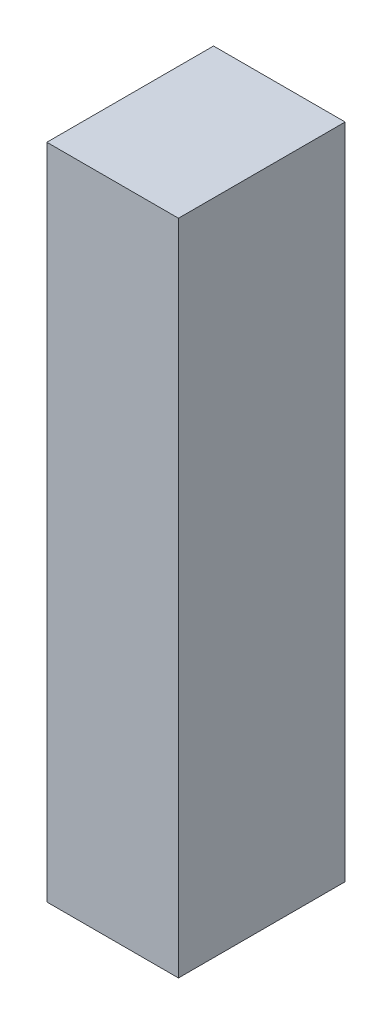
ISO-10303-21;
HEADER;
FILE_DESCRIPTION(('STEP AP214'),'2;1');
FILE_NAME('part.step','',(''),(''),'','','');
FILE_SCHEMA(('AUTOMOTIVE_DESIGN { 1 0 10303 214 1 1 1 1 }'));
ENDSEC;
DATA;
#1=APPLICATION_CONTEXT('core data for automotive mechanical design processes');
#2=APPLICATION_PROTOCOL_DEFINITION('international standard','automotive_design',2000,#1);
#3=PRODUCT_CONTEXT('',#1,'mechanical');
#4=PRODUCT('Part','Part','',(#3));
#5=PRODUCT_RELATED_PRODUCT_CATEGORY('part','',(#4));
#6=PRODUCT_DEFINITION_FORMATION('','',#4);
#7=PRODUCT_DEFINITION_CONTEXT('part definition',#1,'design');
#8=PRODUCT_DEFINITION('design','',#6,#7);
#9=PRODUCT_DEFINITION_SHAPE('','',#8);
#10=(LENGTH_UNIT() NAMED_UNIT(*) SI_UNIT(.MILLI.,.METRE.));
#11=(NAMED_UNIT(*) PLANE_ANGLE_UNIT() SI_UNIT($,.RADIAN.));
#12=(NAMED_UNIT(*) SI_UNIT($,.STERADIAN.) SOLID_ANGLE_UNIT());
#13=UNCERTAINTY_MEASURE_WITH_UNIT(LENGTH_MEASURE(1.E-05),#10,'distance_accuracy_value','');
#14=(GEOMETRIC_REPRESENTATION_CONTEXT(3) GLOBAL_UNCERTAINTY_ASSIGNED_CONTEXT((#13)) GLOBAL_UNIT_ASSIGNED_CONTEXT((#10,
#11,#12)) REPRESENTATION_CONTEXT('',''));
#15=CARTESIAN_POINT('',(0.,0.,0.));
#16=DIRECTION('',(0.,0.,1.));
#17=DIRECTION('',(1.,0.,0.));
#18=AXIS2_PLACEMENT_3D('',#15,#16,#17);
#19=CARTESIAN_POINT('',(7.5,75.,9.50000000000001));
#20=DIRECTION('',(-1.,0.,0.));
#21=DIRECTION('',(0.,0.,1.));
#22=AXIS2_PLACEMENT_3D('',#19,#20,#21);
#23=PLANE('',#22);
#24=DIRECTION('',(0.,0.,-1.));
#25=VECTOR('',#24,1.);
#26=CARTESIAN_POINT('',(7.5,0.,9.50000000000001));
#27=LINE('',#26,#25);
#28=CARTESIAN_POINT('',(7.5,0.,9.50000000000001));
#29=VERTEX_POINT('',#28);
#30=CARTESIAN_POINT('',(7.5,0.,-9.49999999999999));
#31=VERTEX_POINT('',#30);
#32=EDGE_CURVE('E97',#29,#31,#27,.T.);
#33=ORIENTED_EDGE('',*,*,#32,.T.);
#34=DIRECTION('',(0.,-1.,0.));
#35=VECTOR('',#34,1.);
#36=CARTESIAN_POINT('',(7.5,75.,-9.49999999999999));
#37=LINE('',#36,#35);
#38=CARTESIAN_POINT('',(7.5,75.,-9.49999999999999));
#39=VERTEX_POINT('',#38);
#40=EDGE_CURVE('E11',#39,#31,#37,.T.);
#41=ORIENTED_EDGE('',*,*,#40,.F.);
#42=DIRECTION('',(0.,0.,-1.));
#43=VECTOR('',#42,1.);
#44=CARTESIAN_POINT('',(7.5,75.,9.50000000000001));
#45=LINE('',#44,#43);
#46=CARTESIAN_POINT('',(7.5,75.,9.50000000000001));
#47=VERTEX_POINT('',#46);
#48=EDGE_CURVE('E85',#47,#39,#45,.T.);
#49=ORIENTED_EDGE('',*,*,#48,.F.);
#50=DIRECTION('',(0.,-1.,0.));
#51=VECTOR('',#50,1.);
#52=CARTESIAN_POINT('',(7.5,75.,9.50000000000001));
#53=LINE('',#52,#51);
#54=EDGE_CURVE('E93',#47,#29,#53,.T.);
#55=ORIENTED_EDGE('',*,*,#54,.T.);
#56=EDGE_LOOP('',(#33,#41,#49,#55));
#57=FACE_BOUND('',#56,.T.);
#58=ADVANCED_FACE('F34',(#57),#23,.F.);
#59=CARTESIAN_POINT('',(-7.5,75.,-9.49999999999999));
#60=DIRECTION('',(0.,0.,1.));
#61=DIRECTION('',(1.,0.,0.));
#62=AXIS2_PLACEMENT_3D('',#59,#60,#61);
#63=PLANE('',#62);
#64=DIRECTION('',(-1.,0.,0.));
#65=VECTOR('',#64,1.);
#66=CARTESIAN_POINT('',(-7.5,0.,-9.49999999999999));
#67=LINE('',#66,#65);
#68=CARTESIAN_POINT('',(-7.5,0.,-9.49999999999999));
#69=VERTEX_POINT('',#68);
#70=EDGE_CURVE('E89',#31,#69,#67,.T.);
#71=ORIENTED_EDGE('',*,*,#70,.T.);
#72=DIRECTION('',(0.,-1.,0.));
#73=VECTOR('',#72,1.);
#74=CARTESIAN_POINT('',(-7.5,75.,-9.49999999999999));
#75=LINE('',#74,#73);
#76=CARTESIAN_POINT('',(-7.5,75.,-9.49999999999999));
#77=VERTEX_POINT('',#76);
#78=EDGE_CURVE('E42',#77,#69,#75,.T.);
#79=ORIENTED_EDGE('',*,*,#78,.F.);
#80=DIRECTION('',(-1.,0.,0.));
#81=VECTOR('',#80,1.);
#82=CARTESIAN_POINT('',(-7.5,75.,-9.49999999999999));
#83=LINE('',#82,#81);
#84=EDGE_CURVE('E80',#39,#77,#83,.T.);
#85=ORIENTED_EDGE('',*,*,#84,.F.);
#86=ORIENTED_EDGE('',*,*,#40,.T.);
#87=EDGE_LOOP('',(#71,#79,#85,#86));
#88=FACE_BOUND('',#87,.T.);
#89=ADVANCED_FACE('F88',(#88),#63,.F.);
#90=CARTESIAN_POINT('',(-7.5,75.,9.50000000000001));
#91=DIRECTION('',(1.,0.,0.));
#92=DIRECTION('',(0.,0.,-1.));
#93=AXIS2_PLACEMENT_3D('',#90,#91,#92);
#94=PLANE('',#93);
#95=DIRECTION('',(0.,0.,1.));
#96=VECTOR('',#95,1.);
#97=CARTESIAN_POINT('',(-7.5,0.,9.50000000000001));
#98=LINE('',#97,#96);
#99=CARTESIAN_POINT('',(-7.5,0.,9.50000000000001));
#100=VERTEX_POINT('',#99);
#101=EDGE_CURVE('E67',#69,#100,#98,.T.);
#102=ORIENTED_EDGE('',*,*,#101,.T.);
#103=DIRECTION('',(0.,-1.,0.));
#104=VECTOR('',#103,1.);
#105=CARTESIAN_POINT('',(-7.5,75.,9.50000000000001));
#106=LINE('',#105,#104);
#107=CARTESIAN_POINT('',(-7.5,75.,9.50000000000001));
#108=VERTEX_POINT('',#107);
#109=EDGE_CURVE('E90',#108,#100,#106,.T.);
#110=ORIENTED_EDGE('',*,*,#109,.F.);
#111=DIRECTION('',(0.,0.,1.));
#112=VECTOR('',#111,1.);
#113=CARTESIAN_POINT('',(-7.5,75.,9.50000000000001));
#114=LINE('',#113,#112);
#115=EDGE_CURVE('E83',#77,#108,#114,.T.);
#116=ORIENTED_EDGE('',*,*,#115,.F.);
#117=ORIENTED_EDGE('',*,*,#78,.T.);
#118=EDGE_LOOP('',(#102,#110,#116,#117));
#119=FACE_BOUND('',#118,.T.);
#120=ADVANCED_FACE('F91',(#119),#94,.F.);
#121=CARTESIAN_POINT('',(-7.5,75.,9.50000000000001));
#122=DIRECTION('',(0.,0.,-1.));
#123=DIRECTION('',(-1.,0.,0.));
#124=AXIS2_PLACEMENT_3D('',#121,#122,#123);
#125=PLANE('',#124);
#126=DIRECTION('',(1.,0.,0.));
#127=VECTOR('',#126,1.);
#128=CARTESIAN_POINT('',(-7.5,0.,9.50000000000001));
#129=LINE('',#128,#127);
#130=EDGE_CURVE('E73',#100,#29,#129,.T.);
#131=ORIENTED_EDGE('',*,*,#130,.T.);
#132=ORIENTED_EDGE('',*,*,#54,.F.);
#133=DIRECTION('',(1.,0.,0.));
#134=VECTOR('',#133,1.);
#135=CARTESIAN_POINT('',(-7.5,75.,9.50000000000001));
#136=LINE('',#135,#134);
#137=EDGE_CURVE('E50',#108,#47,#136,.T.);
#138=ORIENTED_EDGE('',*,*,#137,.F.);
#139=ORIENTED_EDGE('',*,*,#109,.T.);
#140=EDGE_LOOP('',(#131,#132,#138,#139));
#141=FACE_BOUND('',#140,.T.);
#142=ADVANCED_FACE('F104',(#141),#125,.F.);
#143=CARTESIAN_POINT('',(0.,75.,0.));
#144=DIRECTION('',(0.,-1.,0.));
#145=DIRECTION('',(0.,0.,-1.));
#146=AXIS2_PLACEMENT_3D('',#143,#144,#145);
#147=PLANE('',#146);
#148=ORIENTED_EDGE('',*,*,#48,.T.);
#149=ORIENTED_EDGE('',*,*,#84,.T.);
#150=ORIENTED_EDGE('',*,*,#115,.T.);
#151=ORIENTED_EDGE('',*,*,#137,.T.);
#152=EDGE_LOOP('',(#148,#149,#150,#151));
#153=FACE_BOUND('',#152,.T.);
#154=ADVANCED_FACE('F81',(#153),#147,.F.);
#155=CARTESIAN_POINT('',(0.,0.,0.));
#156=DIRECTION('',(0.,-1.,0.));
#157=DIRECTION('',(0.,0.,-1.));
#158=AXIS2_PLACEMENT_3D('',#155,#156,#157);
#159=PLANE('',#158);
#160=ORIENTED_EDGE('',*,*,#32,.F.);
#161=ORIENTED_EDGE('',*,*,#130,.F.);
#162=ORIENTED_EDGE('',*,*,#101,.F.);
#163=ORIENTED_EDGE('',*,*,#70,.F.);
#164=EDGE_LOOP('',(#160,#161,#162,#163));
#165=FACE_BOUND('',#164,.T.);
#166=ADVANCED_FACE('F107',(#165),#159,.T.);
#167=CLOSED_SHELL('',(#58,#89,#120,#142,#154,#166));
#168=MANIFOLD_SOLID_BREP('B2',#167);
#169=ADVANCED_BREP_SHAPE_REPRESENTATION('',(#18,#168),#14);
#170=SHAPE_DEFINITION_REPRESENTATION(#9,#169);
ENDSEC;
END-ISO-10303-21;
